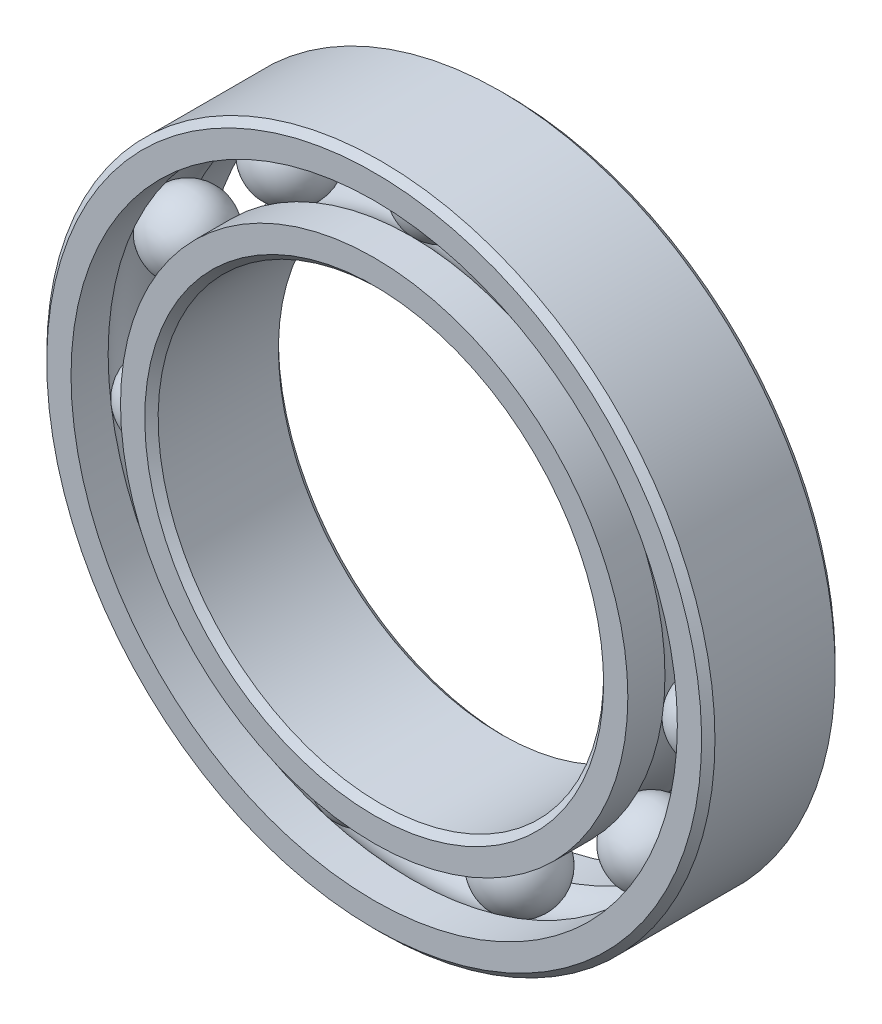
ISO-10303-21;
HEADER;
FILE_DESCRIPTION(('STEP AP214'),'2;1');
FILE_NAME('part.step','',(''),(''),'','','');
FILE_SCHEMA(('AUTOMOTIVE_DESIGN { 1 0 10303 214 1 1 1 1 }'));
ENDSEC;
DATA;
#1=APPLICATION_CONTEXT('core data for automotive mechanical design processes');
#2=APPLICATION_PROTOCOL_DEFINITION('international standard','automotive_design',2000,#1);
#3=PRODUCT_CONTEXT('',#1,'mechanical');
#4=PRODUCT('Part','Part','',(#3));
#5=PRODUCT_RELATED_PRODUCT_CATEGORY('part','',(#4));
#6=PRODUCT_DEFINITION_FORMATION('','',#4);
#7=PRODUCT_DEFINITION_CONTEXT('part definition',#1,'design');
#8=PRODUCT_DEFINITION('design','',#6,#7);
#9=PRODUCT_DEFINITION_SHAPE('','',#8);
#10=(LENGTH_UNIT() NAMED_UNIT(*) SI_UNIT(.MILLI.,.METRE.));
#11=(NAMED_UNIT(*) PLANE_ANGLE_UNIT() SI_UNIT($,.RADIAN.));
#12=(NAMED_UNIT(*) SI_UNIT($,.STERADIAN.) SOLID_ANGLE_UNIT());
#13=UNCERTAINTY_MEASURE_WITH_UNIT(LENGTH_MEASURE(1.E-05),#10,'distance_accuracy_value','');
#14=(GEOMETRIC_REPRESENTATION_CONTEXT(3) GLOBAL_UNCERTAINTY_ASSIGNED_CONTEXT((#13)) GLOBAL_UNIT_ASSIGNED_CONTEXT((#10,
#11,#12)) REPRESENTATION_CONTEXT('',''));
#15=CARTESIAN_POINT('',(0.,0.,0.));
#16=DIRECTION('',(0.,0.,1.));
#17=DIRECTION('',(1.,0.,0.));
#18=AXIS2_PLACEMENT_3D('',#15,#16,#17);
#19=CARTESIAN_POINT('',(3.37900510909741,5.25783458019493,0.));
#20=DIRECTION('',(0.,0.,1.));
#21=DIRECTION('',(0.540640817455586,0.841253532831188,0.));
#22=AXIS2_PLACEMENT_3D('',#19,#20,#21);
#23=SPHERICAL_SURFACE('',#22,0.867805519545181);
#24=CARTESIAN_POINT('',(3.37900510909741,5.25783458019493,0.867805519545174));
#25=VERTEX_POINT('',#24);
#26=VERTEX_LOOP('',#25);
#27=FACE_BOUND('',#26,.T.);
#28=ADVANCED_FACE('F37',(#27),#23,.T.);
#29=CLOSED_SHELL('',(#28));
#30=MANIFOLD_SOLID_BREP('B2',#29);
#31=CARTESIAN_POINT('',(5.68519997096571,2.59634383126186,0.));
#32=DIRECTION('',(0.,0.,1.));
#33=DIRECTION('',(0.909631995354513,0.415415013001897,0.));
#34=AXIS2_PLACEMENT_3D('',#31,#32,#33);
#35=SPHERICAL_SURFACE('',#34,0.867805519545181);
#36=CARTESIAN_POINT('',(5.68519997096571,2.59634383126186,0.867805519545174));
#37=VERTEX_POINT('',#36);
#38=VERTEX_LOOP('',#37);
#39=FACE_BOUND('',#38,.T.);
#40=ADVANCED_FACE('F55',(#39),#35,.T.);
#41=CLOSED_SHELL('',(#40));
#42=MANIFOLD_SOLID_BREP('B6',#41);
#43=CARTESIAN_POINT('',(6.18638401175584,-0.889467739207967,0.));
#44=DIRECTION('',(0.,0.,1.));
#45=DIRECTION('',(0.989821441880934,-0.142314838273275,0.));
#46=AXIS2_PLACEMENT_3D('',#43,#44,#45);
#47=SPHERICAL_SURFACE('',#46,0.867805519545181);
#48=CARTESIAN_POINT('',(6.18638401175584,-0.889467739207967,0.867805519545173));
#49=VERTEX_POINT('',#48);
#50=VERTEX_LOOP('',#49);
#51=FACE_BOUND('',#50,.T.);
#52=ADVANCED_FACE('F73',(#51),#47,.T.);
#53=CLOSED_SHELL('',(#52));
#54=MANIFOLD_SOLID_BREP('B33',#53);
#55=CARTESIAN_POINT('',(4.72343483971415,-4.09287958715799,0.));
#56=DIRECTION('',(0.,0.,1.));
#57=DIRECTION('',(0.755749574354264,-0.654860733945278,0.));
#58=AXIS2_PLACEMENT_3D('',#55,#56,#57);
#59=SPHERICAL_SURFACE('',#58,0.867805519545181);
#60=CARTESIAN_POINT('',(4.72343483971415,-4.09287958715799,0.867805519545173));
#61=VERTEX_POINT('',#60);
#62=VERTEX_LOOP('',#61);
#63=FACE_BOUND('',#62,.T.);
#64=ADVANCED_FACE('F91',(#63),#59,.T.);
#65=CLOSED_SHELL('',(#64));
#66=MANIFOLD_SOLID_BREP('B51',#65);
#67=CARTESIAN_POINT('',(1.76082848025898,-5.99683108509059,0.));
#68=DIRECTION('',(0.,0.,1.));
#69=DIRECTION('',(0.281732556841437,-0.959492973614495,0.));
#70=AXIS2_PLACEMENT_3D('',#67,#68,#69);
#71=SPHERICAL_SURFACE('',#70,0.867805519545181);
#72=CARTESIAN_POINT('',(1.76082848025898,-5.99683108509059,0.867805519545173));
#73=VERTEX_POINT('',#72);
#74=VERTEX_LOOP('',#73);
#75=FACE_BOUND('',#74,.T.);
#76=ADVANCED_FACE('F109',(#75),#71,.T.);
#77=CLOSED_SHELL('',(#76));
#78=MANIFOLD_SOLID_BREP('B69',#77);
#79=CARTESIAN_POINT('',(-1.7608284802589,-5.99683108509062,0.));
#80=DIRECTION('',(0.,0.,1.));
#81=DIRECTION('',(-0.281732556841423,-0.959492973614499,0.));
#82=AXIS2_PLACEMENT_3D('',#79,#80,#81);
#83=SPHERICAL_SURFACE('',#82,0.867805519545181);
#84=CARTESIAN_POINT('',(-1.7608284802589,-5.99683108509062,0.867805519545173));
#85=VERTEX_POINT('',#84);
#86=VERTEX_LOOP('',#85);
#87=FACE_BOUND('',#86,.T.);
#88=ADVANCED_FACE('F127',(#87),#83,.T.);
#89=CLOSED_SHELL('',(#88));
#90=MANIFOLD_SOLID_BREP('B87',#89);
#91=CARTESIAN_POINT('',(-4.72343483971409,-4.09287958715806,0.));
#92=DIRECTION('',(0.,0.,1.));
#93=DIRECTION('',(-0.755749574354255,-0.654860733945289,0.));
#94=AXIS2_PLACEMENT_3D('',#91,#92,#93);
#95=SPHERICAL_SURFACE('',#94,0.867805519545181);
#96=CARTESIAN_POINT('',(-4.72343483971409,-4.09287958715806,0.867805519545173));
#97=VERTEX_POINT('',#96);
#98=VERTEX_LOOP('',#97);
#99=FACE_BOUND('',#98,.T.);
#100=ADVANCED_FACE('F145',(#99),#95,.T.);
#101=CLOSED_SHELL('',(#100));
#102=MANIFOLD_SOLID_BREP('B105',#101);
#103=CARTESIAN_POINT('',(-6.18638401175583,-0.889467739208056,0.));
#104=DIRECTION('',(0.,0.,1.));
#105=DIRECTION('',(-0.989821441880932,-0.142314838273289,0.));
#106=AXIS2_PLACEMENT_3D('',#103,#104,#105);
#107=SPHERICAL_SURFACE('',#106,0.867805519545181);
#108=CARTESIAN_POINT('',(-6.18638401175583,-0.889467739208056,0.867805519545173));
#109=VERTEX_POINT('',#108);
#110=VERTEX_LOOP('',#109);
#111=FACE_BOUND('',#110,.T.);
#112=ADVANCED_FACE('F163',(#111),#107,.T.);
#113=CLOSED_SHELL('',(#112));
#114=MANIFOLD_SOLID_BREP('B123',#113);
#115=CARTESIAN_POINT('',(-5.68519997096575,2.59634383126177,0.));
#116=DIRECTION('',(0.,0.,1.));
#117=DIRECTION('',(-0.909631995354519,0.415415013001884,0.));
#118=AXIS2_PLACEMENT_3D('',#115,#116,#117);
#119=SPHERICAL_SURFACE('',#118,0.867805519545181);
#120=CARTESIAN_POINT('',(-5.68519997096575,2.59634383126177,0.867805519545174));
#121=VERTEX_POINT('',#120);
#122=VERTEX_LOOP('',#121);
#123=FACE_BOUND('',#122,.T.);
#124=ADVANCED_FACE('F181',(#123),#119,.T.);
#125=CLOSED_SHELL('',(#124));
#126=MANIFOLD_SOLID_BREP('B141',#125);
#127=CARTESIAN_POINT('',(-3.37900510909749,5.25783458019488,0.));
#128=DIRECTION('',(0.,0.,1.));
#129=DIRECTION('',(-0.540640817455599,0.841253532831181,0.));
#130=AXIS2_PLACEMENT_3D('',#127,#128,#129);
#131=SPHERICAL_SURFACE('',#130,0.867805519545181);
#132=CARTESIAN_POINT('',(-3.37900510909749,5.25783458019488,0.867805519545174));
#133=VERTEX_POINT('',#132);
#134=VERTEX_LOOP('',#133);
#135=FACE_BOUND('',#134,.T.);
#136=ADVANCED_FACE('F199',(#135),#131,.T.);
#137=CLOSED_SHELL('',(#136));
#138=MANIFOLD_SOLID_BREP('B159',#137);
#139=CARTESIAN_POINT('',(0.,6.25,0.));
#140=DIRECTION('',(0.,0.,1.));
#141=DIRECTION('',(0.,1.,0.));
#142=AXIS2_PLACEMENT_3D('',#139,#140,#141);
#143=SPHERICAL_SURFACE('',#142,0.867805519545181);
#144=CARTESIAN_POINT('',(0.,6.25,0.867805519545174));
#145=VERTEX_POINT('',#144);
#146=VERTEX_LOOP('',#145);
#147=FACE_BOUND('',#146,.T.);
#148=ADVANCED_FACE('F219',(#147),#143,.T.);
#149=CLOSED_SHELL('',(#148));
#150=MANIFOLD_SOLID_BREP('B177',#149);
#151=CARTESIAN_POINT('',(0.,5.69444444444445,1.5));
#152=DIRECTION('',(0.,0.,-1.));
#153=DIRECTION('',(0.,1.,0.));
#154=AXIS2_PLACEMENT_3D('',#151,#152,#153);
#155=PLANE('',#154);
#156=CARTESIAN_POINT('',(0.,0.,1.5));
#157=DIRECTION('',(0.,0.,1.));
#158=DIRECTION('',(0.,-1.,0.));
#159=AXIS2_PLACEMENT_3D('',#156,#157,#158);
#160=CIRCLE('',#159,5.15);
#161=CARTESIAN_POINT('',(0.,-5.15,1.5));
#162=VERTEX_POINT('',#161);
#163=EDGE_CURVE('E266',#162,#162,#160,.T.);
#164=ORIENTED_EDGE('',*,*,#163,.F.);
#165=EDGE_LOOP('',(#164));
#166=FACE_BOUND('',#165,.T.);
#167=CARTESIAN_POINT('',(0.,0.,1.5));
#168=DIRECTION('',(0.,0.,1.));
#169=DIRECTION('',(0.,-1.,0.));
#170=AXIS2_PLACEMENT_3D('',#167,#168,#169);
#171=CIRCLE('',#170,5.69444444444445);
#172=CARTESIAN_POINT('',(0.,-5.69444444444445,1.5));
#173=VERTEX_POINT('',#172);
#174=EDGE_CURVE('E218',#173,#173,#171,.T.);
#175=ORIENTED_EDGE('',*,*,#174,.T.);
#176=EDGE_LOOP('',(#175));
#177=FACE_BOUND('',#176,.T.);
#178=ADVANCED_FACE('F238',(#166,#177),#155,.F.);
#179=CARTESIAN_POINT('',(0.,0.,1.49999999999999));
#180=DIRECTION('',(0.,0.,1.));
#181=DIRECTION('',(0.,-1.,0.));
#182=AXIS2_PLACEMENT_3D('',#179,#180,#181);
#183=CYLINDRICAL_SURFACE('',#182,5.69444444444445);
#184=ORIENTED_EDGE('',*,*,#174,.F.);
#185=EDGE_LOOP('',(#184));
#186=FACE_BOUND('',#185,.T.);
#187=CARTESIAN_POINT('',(0.,0.,0.666666666666659));
#188=DIRECTION('',(0.,0.,1.));
#189=DIRECTION('',(0.,-1.,0.));
#190=AXIS2_PLACEMENT_3D('',#187,#188,#189);
#191=CIRCLE('',#190,5.69444444444445);
#192=CARTESIAN_POINT('',(0.,-5.69444444444445,0.666666666666659));
#193=VERTEX_POINT('',#192);
#194=EDGE_CURVE('E244',#193,#193,#191,.T.);
#195=ORIENTED_EDGE('',*,*,#194,.T.);
#196=EDGE_LOOP('',(#195));
#197=FACE_BOUND('',#196,.T.);
#198=ADVANCED_FACE('F273',(#186,#197),#183,.T.);
#199=CARTESIAN_POINT('',(0.,0.,0.));
#200=DIRECTION('',(0.,0.,1.));
#201=DIRECTION('',(0.,-1.,0.));
#202=AXIS2_PLACEMENT_3D('',#199,#200,#201);
#203=TOROIDAL_SURFACE('',#202,6.25000000000001,0.867805519545181);
#204=ORIENTED_EDGE('',*,*,#194,.F.);
#205=EDGE_LOOP('',(#204));
#206=FACE_BOUND('',#205,.T.);
#207=CARTESIAN_POINT('',(0.,0.,-0.666666666666661));
#208=DIRECTION('',(0.,0.,1.));
#209=DIRECTION('',(0.,-1.,0.));
#210=AXIS2_PLACEMENT_3D('',#207,#208,#209);
#211=CIRCLE('',#210,5.69444444444445);
#212=CARTESIAN_POINT('',(0.,-5.69444444444445,-0.666666666666662));
#213=VERTEX_POINT('',#212);
#214=EDGE_CURVE('E248',#213,#213,#211,.T.);
#215=ORIENTED_EDGE('',*,*,#214,.T.);
#216=EDGE_LOOP('',(#215));
#217=FACE_BOUND('',#216,.T.);
#218=ADVANCED_FACE('F277',(#206,#217),#203,.F.);
#219=CARTESIAN_POINT('',(0.,0.,1.49999999999999));
#220=DIRECTION('',(0.,0.,1.));
#221=DIRECTION('',(0.,-1.,0.));
#222=AXIS2_PLACEMENT_3D('',#219,#220,#221);
#223=CYLINDRICAL_SURFACE('',#222,5.69444444444445);
#224=ORIENTED_EDGE('',*,*,#214,.F.);
#225=EDGE_LOOP('',(#224));
#226=FACE_BOUND('',#225,.T.);
#227=CARTESIAN_POINT('',(0.,0.,-1.5));
#228=DIRECTION('',(0.,0.,1.));
#229=DIRECTION('',(0.,-1.,0.));
#230=AXIS2_PLACEMENT_3D('',#227,#228,#229);
#231=CIRCLE('',#230,5.69444444444445);
#232=CARTESIAN_POINT('',(0.,-5.69444444444445,-1.5));
#233=VERTEX_POINT('',#232);
#234=EDGE_CURVE('E252',#233,#233,#231,.T.);
#235=ORIENTED_EDGE('',*,*,#234,.T.);
#236=EDGE_LOOP('',(#235));
#237=FACE_BOUND('',#236,.T.);
#238=ADVANCED_FACE('F282',(#226,#237),#223,.T.);
#239=CARTESIAN_POINT('',(0.,5.15,-1.50000000000001));
#240=DIRECTION('',(0.,0.,1.));
#241=DIRECTION('',(0.,-1.,0.));
#242=AXIS2_PLACEMENT_3D('',#239,#240,#241);
#243=PLANE('',#242);
#244=ORIENTED_EDGE('',*,*,#234,.F.);
#245=EDGE_LOOP('',(#244));
#246=FACE_BOUND('',#245,.T.);
#247=CARTESIAN_POINT('',(0.,0.,-1.50000000000001));
#248=DIRECTION('',(0.,0.,1.));
#249=DIRECTION('',(0.,-1.,0.));
#250=AXIS2_PLACEMENT_3D('',#247,#248,#249);
#251=CIRCLE('',#250,5.15);
#252=CARTESIAN_POINT('',(0.,-5.15,-1.50000000000001));
#253=VERTEX_POINT('',#252);
#254=EDGE_CURVE('E257',#253,#253,#251,.T.);
#255=ORIENTED_EDGE('',*,*,#254,.T.);
#256=EDGE_LOOP('',(#255));
#257=FACE_BOUND('',#256,.T.);
#258=ADVANCED_FACE('F288',(#246,#257),#243,.F.);
#259=CARTESIAN_POINT('',(0.,0.,-1.35000000000001));
#260=DIRECTION('',(0.,0.,-1.));
#261=DIRECTION('',(0.,1.,0.));
#262=AXIS2_PLACEMENT_3D('',#259,#260,#261);
#263=CONICAL_SURFACE('',#262,5.,0.785398163397454);
#264=ORIENTED_EDGE('',*,*,#254,.F.);
#265=EDGE_LOOP('',(#264));
#266=FACE_BOUND('',#265,.T.);
#267=CARTESIAN_POINT('',(0.,0.,-1.35000000000001));
#268=DIRECTION('',(0.,0.,1.));
#269=DIRECTION('',(0.,-1.,0.));
#270=AXIS2_PLACEMENT_3D('',#267,#268,#269);
#271=CIRCLE('',#270,5.);
#272=CARTESIAN_POINT('',(0.,-5.,-1.35000000000001));
#273=VERTEX_POINT('',#272);
#274=EDGE_CURVE('E260',#273,#273,#271,.T.);
#275=ORIENTED_EDGE('',*,*,#274,.T.);
#276=EDGE_LOOP('',(#275));
#277=FACE_BOUND('',#276,.T.);
#278=ADVANCED_FACE('F292',(#266,#277),#263,.F.);
#279=CARTESIAN_POINT('',(0.,0.,1.49999999999999));
#280=DIRECTION('',(0.,0.,1.));
#281=DIRECTION('',(0.,-1.,0.));
#282=AXIS2_PLACEMENT_3D('',#279,#280,#281);
#283=CYLINDRICAL_SURFACE('',#282,5.);
#284=ORIENTED_EDGE('',*,*,#274,.F.);
#285=EDGE_LOOP('',(#284));
#286=FACE_BOUND('',#285,.T.);
#287=CARTESIAN_POINT('',(0.,0.,1.35));
#288=DIRECTION('',(0.,0.,1.));
#289=DIRECTION('',(0.,-1.,0.));
#290=AXIS2_PLACEMENT_3D('',#287,#288,#289);
#291=CIRCLE('',#290,5.);
#292=CARTESIAN_POINT('',(0.,-5.,1.35));
#293=VERTEX_POINT('',#292);
#294=EDGE_CURVE('E263',#293,#293,#291,.T.);
#295=ORIENTED_EDGE('',*,*,#294,.T.);
#296=EDGE_LOOP('',(#295));
#297=FACE_BOUND('',#296,.T.);
#298=ADVANCED_FACE('F296',(#286,#297),#283,.F.);
#299=CARTESIAN_POINT('',(0.,0.,1.5));
#300=DIRECTION('',(0.,0.,1.));
#301=DIRECTION('',(0.,-1.,0.));
#302=AXIS2_PLACEMENT_3D('',#299,#300,#301);
#303=CONICAL_SURFACE('',#302,5.15,0.785398163397451);
#304=ORIENTED_EDGE('',*,*,#294,.F.);
#305=EDGE_LOOP('',(#304));
#306=FACE_BOUND('',#305,.T.);
#307=ORIENTED_EDGE('',*,*,#163,.T.);
#308=EDGE_LOOP('',(#307));
#309=FACE_BOUND('',#308,.T.);
#310=ADVANCED_FACE('F270',(#306,#309),#303,.F.);
#311=CLOSED_SHELL('',(#178,#198,#218,#238,#258,#278,#298,#310));
#312=MANIFOLD_SOLID_BREP('B195',#311);
#313=CARTESIAN_POINT('',(0.,0.,1.49999999999999));
#314=DIRECTION('',(0.,0.,1.));
#315=DIRECTION('',(0.,-1.,0.));
#316=AXIS2_PLACEMENT_3D('',#313,#314,#315);
#317=CYLINDRICAL_SURFACE('',#316,7.5);
#318=CARTESIAN_POINT('',(0.,0.,1.35));
#319=DIRECTION('',(0.,0.,1.));
#320=DIRECTION('',(0.,-1.,0.));
#321=AXIS2_PLACEMENT_3D('',#318,#319,#320);
#322=CIRCLE('',#321,7.5);
#323=CARTESIAN_POINT('',(0.,-7.5,1.35));
#324=VERTEX_POINT('',#323);
#325=EDGE_CURVE('E237',#324,#324,#322,.T.);
#326=ORIENTED_EDGE('',*,*,#325,.F.);
#327=EDGE_LOOP('',(#326));
#328=FACE_BOUND('',#327,.T.);
#329=CARTESIAN_POINT('',(0.,0.,-1.35000000000001));
#330=DIRECTION('',(0.,0.,1.));
#331=DIRECTION('',(0.,-1.,0.));
#332=AXIS2_PLACEMENT_3D('',#329,#330,#331);
#333=CIRCLE('',#332,7.5);
#334=CARTESIAN_POINT('',(0.,-7.5,-1.35000000000001));
#335=VERTEX_POINT('',#334);
#336=EDGE_CURVE('E387',#335,#335,#333,.T.);
#337=ORIENTED_EDGE('',*,*,#336,.T.);
#338=EDGE_LOOP('',(#337));
#339=FACE_BOUND('',#338,.T.);
#340=ADVANCED_FACE('F359',(#328,#339),#317,.T.);
#341=CARTESIAN_POINT('',(0.,0.,1.35));
#342=DIRECTION('',(0.,0.,-1.));
#343=DIRECTION('',(0.,1.,0.));
#344=AXIS2_PLACEMENT_3D('',#341,#342,#343);
#345=CONICAL_SURFACE('',#344,7.5,0.78539816339746);
#346=CARTESIAN_POINT('',(0.,0.,1.49999999999999));
#347=DIRECTION('',(0.,0.,1.));
#348=DIRECTION('',(0.,-1.,0.));
#349=AXIS2_PLACEMENT_3D('',#346,#347,#348);
#350=CIRCLE('',#349,7.35);
#351=CARTESIAN_POINT('',(0.,-7.35,1.49999999999999));
#352=VERTEX_POINT('',#351);
#353=EDGE_CURVE('E365',#352,#352,#350,.T.);
#354=ORIENTED_EDGE('',*,*,#353,.F.);
#355=EDGE_LOOP('',(#354));
#356=FACE_BOUND('',#355,.T.);
#357=ORIENTED_EDGE('',*,*,#325,.T.);
#358=EDGE_LOOP('',(#357));
#359=FACE_BOUND('',#358,.T.);
#360=ADVANCED_FACE('F424',(#356,#359),#345,.T.);
#361=CARTESIAN_POINT('',(0.,7.35,1.49999999999999));
#362=DIRECTION('',(0.,0.,-1.));
#363=DIRECTION('',(0.,1.,0.));
#364=AXIS2_PLACEMENT_3D('',#361,#362,#363);
#365=PLANE('',#364);
#366=CARTESIAN_POINT('',(0.,0.,1.49999999999999));
#367=DIRECTION('',(0.,0.,1.));
#368=DIRECTION('',(0.,-1.,0.));
#369=AXIS2_PLACEMENT_3D('',#366,#367,#368);
#370=CIRCLE('',#369,6.80555555555555);
#371=CARTESIAN_POINT('',(0.,-6.80555555555555,1.49999999999999));
#372=VERTEX_POINT('',#371);
#373=EDGE_CURVE('E369',#372,#372,#370,.T.);
#374=ORIENTED_EDGE('',*,*,#373,.F.);
#375=EDGE_LOOP('',(#374));
#376=FACE_BOUND('',#375,.T.);
#377=ORIENTED_EDGE('',*,*,#353,.T.);
#378=EDGE_LOOP('',(#377));
#379=FACE_BOUND('',#378,.T.);
#380=ADVANCED_FACE('F419',(#376,#379),#365,.F.);
#381=CARTESIAN_POINT('',(0.,0.,1.49999999999999));
#382=DIRECTION('',(0.,0.,1.));
#383=DIRECTION('',(0.,-1.,0.));
#384=AXIS2_PLACEMENT_3D('',#381,#382,#383);
#385=CYLINDRICAL_SURFACE('',#384,6.80555555555555);
#386=CARTESIAN_POINT('',(0.,0.,0.666666666666659));
#387=DIRECTION('',(0.,0.,1.));
#388=DIRECTION('',(0.,-1.,0.));
#389=AXIS2_PLACEMENT_3D('',#386,#387,#388);
#390=CIRCLE('',#389,6.80555555555555);
#391=CARTESIAN_POINT('',(0.,-6.80555555555555,0.666666666666658));
#392=VERTEX_POINT('',#391);
#393=EDGE_CURVE('E373',#392,#392,#390,.T.);
#394=ORIENTED_EDGE('',*,*,#393,.F.);
#395=EDGE_LOOP('',(#394));
#396=FACE_BOUND('',#395,.T.);
#397=ORIENTED_EDGE('',*,*,#373,.T.);
#398=EDGE_LOOP('',(#397));
#399=FACE_BOUND('',#398,.T.);
#400=ADVANCED_FACE('F413',(#396,#399),#385,.F.);
#401=CARTESIAN_POINT('',(0.,0.,0.));
#402=DIRECTION('',(0.,0.,1.));
#403=DIRECTION('',(0.,-1.,0.));
#404=AXIS2_PLACEMENT_3D('',#401,#402,#403);
#405=TOROIDAL_SURFACE('',#404,6.25,0.867805519545182);
#406=CARTESIAN_POINT('',(0.,0.,-0.666666666666674));
#407=DIRECTION('',(0.,0.,1.));
#408=DIRECTION('',(0.,-1.,0.));
#409=AXIS2_PLACEMENT_3D('',#406,#407,#408);
#410=CIRCLE('',#409,6.80555555555555);
#411=CARTESIAN_POINT('',(0.,-6.80555555555555,-0.666666666666675));
#412=VERTEX_POINT('',#411);
#413=EDGE_CURVE('E378',#412,#412,#410,.T.);
#414=ORIENTED_EDGE('',*,*,#413,.F.);
#415=EDGE_LOOP('',(#414));
#416=FACE_BOUND('',#415,.T.);
#417=ORIENTED_EDGE('',*,*,#393,.T.);
#418=EDGE_LOOP('',(#417));
#419=FACE_BOUND('',#418,.T.);
#420=ADVANCED_FACE('F407',(#416,#419),#405,.F.);
#421=CARTESIAN_POINT('',(0.,0.,1.49999999999999));
#422=DIRECTION('',(0.,0.,1.));
#423=DIRECTION('',(0.,-1.,0.));
#424=AXIS2_PLACEMENT_3D('',#421,#422,#423);
#425=CYLINDRICAL_SURFACE('',#424,6.80555555555555);
#426=CARTESIAN_POINT('',(0.,0.,-1.50000000000001));
#427=DIRECTION('',(0.,0.,1.));
#428=DIRECTION('',(0.,-1.,0.));
#429=AXIS2_PLACEMENT_3D('',#426,#427,#428);
#430=CIRCLE('',#429,6.80555555555555);
#431=CARTESIAN_POINT('',(0.,-6.80555555555555,-1.50000000000001));
#432=VERTEX_POINT('',#431);
#433=EDGE_CURVE('E381',#432,#432,#430,.T.);
#434=ORIENTED_EDGE('',*,*,#433,.F.);
#435=EDGE_LOOP('',(#434));
#436=FACE_BOUND('',#435,.T.);
#437=ORIENTED_EDGE('',*,*,#413,.T.);
#438=EDGE_LOOP('',(#437));
#439=FACE_BOUND('',#438,.T.);
#440=ADVANCED_FACE('F401',(#436,#439),#425,.F.);
#441=CARTESIAN_POINT('',(0.,7.35,-1.50000000000001));
#442=DIRECTION('',(0.,0.,1.));
#443=DIRECTION('',(0.,-1.,0.));
#444=AXIS2_PLACEMENT_3D('',#441,#442,#443);
#445=PLANE('',#444);
#446=CARTESIAN_POINT('',(0.,0.,-1.50000000000001));
#447=DIRECTION('',(0.,0.,1.));
#448=DIRECTION('',(0.,-1.,0.));
#449=AXIS2_PLACEMENT_3D('',#446,#447,#448);
#450=CIRCLE('',#449,7.35);
#451=CARTESIAN_POINT('',(0.,-7.35,-1.50000000000001));
#452=VERTEX_POINT('',#451);
#453=EDGE_CURVE('E384',#452,#452,#450,.T.);
#454=ORIENTED_EDGE('',*,*,#453,.F.);
#455=EDGE_LOOP('',(#454));
#456=FACE_BOUND('',#455,.T.);
#457=ORIENTED_EDGE('',*,*,#433,.T.);
#458=EDGE_LOOP('',(#457));
#459=FACE_BOUND('',#458,.T.);
#460=ADVANCED_FACE('F395',(#456,#459),#445,.F.);
#461=CARTESIAN_POINT('',(0.,0.,-1.50000000000001));
#462=DIRECTION('',(0.,0.,1.));
#463=DIRECTION('',(0.,-1.,0.));
#464=AXIS2_PLACEMENT_3D('',#461,#462,#463);
#465=CONICAL_SURFACE('',#464,7.35,0.78539816339746);
#466=ORIENTED_EDGE('',*,*,#336,.F.);
#467=EDGE_LOOP('',(#466));
#468=FACE_BOUND('',#467,.T.);
#469=ORIENTED_EDGE('',*,*,#453,.T.);
#470=EDGE_LOOP('',(#469));
#471=FACE_BOUND('',#470,.T.);
#472=ADVANCED_FACE('F392',(#468,#471),#465,.T.);
#473=CLOSED_SHELL('',(#340,#360,#380,#400,#420,#440,#460,#472));
#474=MANIFOLD_SOLID_BREP('B213',#473);
#475=ADVANCED_BREP_SHAPE_REPRESENTATION('',(#18,#30,#42,#54,#66,#78,#90,#102,#114,#126,#138,
#150,#312,#474),#14);
#476=SHAPE_DEFINITION_REPRESENTATION(#9,#475);
ENDSEC;
END-ISO-10303-21;
